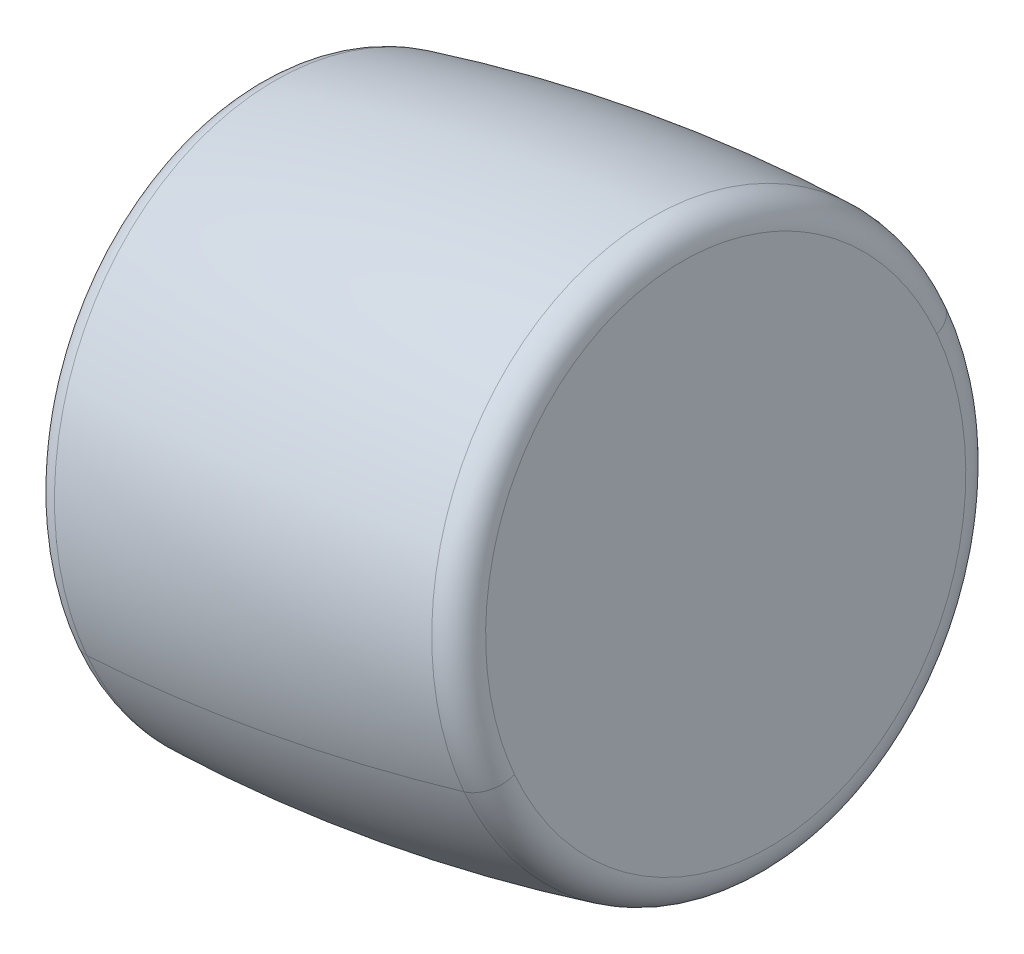
ISO-10303-21;
HEADER;
FILE_DESCRIPTION(('STEP AP214'),'2;1');
FILE_NAME('part.step','',(''),(''),'','','');
FILE_SCHEMA(('AUTOMOTIVE_DESIGN { 1 0 10303 214 1 1 1 1 }'));
ENDSEC;
DATA;
#1=APPLICATION_CONTEXT('core data for automotive mechanical design processes');
#2=APPLICATION_PROTOCOL_DEFINITION('international standard','automotive_design',2000,#1);
#3=PRODUCT_CONTEXT('',#1,'mechanical');
#4=PRODUCT('Part','Part','',(#3));
#5=PRODUCT_RELATED_PRODUCT_CATEGORY('part','',(#4));
#6=PRODUCT_DEFINITION_FORMATION('','',#4);
#7=PRODUCT_DEFINITION_CONTEXT('part definition',#1,'design');
#8=PRODUCT_DEFINITION('design','',#6,#7);
#9=PRODUCT_DEFINITION_SHAPE('','',#8);
#10=(LENGTH_UNIT() NAMED_UNIT(*) SI_UNIT(.MILLI.,.METRE.));
#11=(NAMED_UNIT(*) PLANE_ANGLE_UNIT() SI_UNIT($,.RADIAN.));
#12=(NAMED_UNIT(*) SI_UNIT($,.STERADIAN.) SOLID_ANGLE_UNIT());
#13=UNCERTAINTY_MEASURE_WITH_UNIT(LENGTH_MEASURE(1.E-05),#10,'distance_accuracy_value','');
#14=(GEOMETRIC_REPRESENTATION_CONTEXT(3) GLOBAL_UNCERTAINTY_ASSIGNED_CONTEXT((#13)) GLOBAL_UNIT_ASSIGNED_CONTEXT((#10,
#11,#12)) REPRESENTATION_CONTEXT('',''));
#15=CARTESIAN_POINT('',(0.,0.,0.));
#16=DIRECTION('',(0.,0.,1.));
#17=DIRECTION('',(1.,0.,0.));
#18=AXIS2_PLACEMENT_3D('',#15,#16,#17);
#19=CARTESIAN_POINT('',(1.62144652048644,29.898107644064,0.));
#20=DIRECTION('',(0.982988923693704,0.183664846651431,0.));
#21=DIRECTION('',(-0.183664846651431,0.982988923693704,0.));
#22=AXIS2_PLACEMENT_3D('',#19,#20,#21);
#23=PLANE('',#22);
#24=CARTESIAN_POINT('',(1.88033307099988,28.5125261553482,4.33817842139196));
#25=CARTESIAN_POINT('',(1.8933703069696,28.4427498275017,4.31511603856905));
#26=CARTESIAN_POINT('',(1.90630337528916,28.3735310132361,4.29030854774773));
#27=CARTESIAN_POINT('',(1.93193047390283,28.2363727353025,4.23726961898321));
#28=CARTESIAN_POINT('',(1.94462450419694,28.1684332716346,4.20903818104001));
#29=CARTESIAN_POINT('',(1.96974282403459,28.0339980183329,4.14921762690666));
#30=CARTESIAN_POINT('',(1.98216711357812,27.9675022286991,4.1176285107165));
#31=CARTESIAN_POINT('',(2.00671605332074,27.8361143431272,4.0511691681078));
#32=CARTESIAN_POINT('',(2.01884070351983,27.7712222471891,4.01629894168925));
#33=CARTESIAN_POINT('',(2.04276114649199,27.643198126514,3.94336125890223));
#34=CARTESIAN_POINT('',(2.05455693926505,27.580066101777,3.90529380253376));
#35=CARTESIAN_POINT('',(2.07779125262832,27.4557142015515,3.82605340121778));
#36=CARTESIAN_POINT('',(2.08922977321853,27.3944943260631,3.78488045627027));
#37=CARTESIAN_POINT('',(2.11172198519077,27.2741142117342,3.69952825804146));
#38=CARTESIAN_POINT('',(2.12277567657281,27.2149539728939,3.65534900476016));
#39=CARTESIAN_POINT('',(2.14447160098607,27.098835653159,3.56409062396221));
#40=CARTESIAN_POINT('',(2.1551138340173,27.0418775722644,3.51701149644556));
#41=CARTESIAN_POINT('',(2.17596120361239,26.9303007856678,3.42006678427362));
#42=CARTESIAN_POINT('',(2.18616634017625,26.8756820799658,3.37020119961833));
#43=CARTESIAN_POINT('',(2.20611493178082,26.7689156249359,3.26780370390311));
#44=CARTESIAN_POINT('',(2.21585838682154,26.716767875608,3.21527179284319));
#45=CARTESIAN_POINT('',(2.23486014253996,26.6150689618393,3.10766819824737));
#46=CARTESIAN_POINT('',(2.24411844321767,26.5655177973985,3.05259651471149));
#47=CARTESIAN_POINT('',(2.2621275861537,26.4691314264947,2.94004604768552));
#48=CARTESIAN_POINT('',(2.27087842841201,26.4222962200317,2.88256726419544));
#49=CARTESIAN_POINT('',(2.28785157296353,26.3314545951994,2.76534106868171));
#50=CARTESIAN_POINT('',(2.29607387525673,26.2874481768301,2.70559365665808));
#51=CARTESIAN_POINT('',(2.31197013163166,26.2023701435012,2.58397414082697));
#52=CARTESIAN_POINT('',(2.3196440857134,26.1612985285416,2.52210203701949));
#53=CARTESIAN_POINT('',(2.33442515843785,26.0821890471501,2.39638219293789));
#54=CARTESIAN_POINT('',(2.34153227708056,26.0441511807182,2.33253445266376));
#55=CARTESIAN_POINT('',(2.35516255725565,25.971200832934,2.20301715044764));
#56=CARTESIAN_POINT('',(2.36168571878803,25.9362883515817,2.13734758850565));
#57=CARTESIAN_POINT('',(2.37413236987495,25.8696728811823,2.00434484668048));
#58=CARTESIAN_POINT('',(2.38005585942949,25.8379698921352,1.9370116667973));
#59=CARTESIAN_POINT('',(2.39128889635557,25.7778497816236,1.80084390061779));
#60=CARTESIAN_POINT('',(2.3965984437271,25.7494326601592,1.73200931432145));
#61=CARTESIAN_POINT('',(2.40659080512249,25.6959527441475,1.59300456386321));
#62=CARTESIAN_POINT('',(2.41127361914634,25.6708899496003,1.5228343997013));
#63=CARTESIAN_POINT('',(2.42000123253721,25.6241790658906,1.38132753958357));
#64=CARTESIAN_POINT('',(2.42404603190422,25.602530976728,1.30999084362774));
#65=CARTESIAN_POINT('',(2.43148787170546,25.5627016559304,1.16632277627106));
#66=CARTESIAN_POINT('',(2.43488491213969,25.5445204242954,1.09399140487022));
#67=CARTESIAN_POINT('',(2.44102305030739,25.5116686187324,0.948508239232712));
#68=CARTESIAN_POINT('',(2.44376414804087,25.4969980448044,0.875356444996044));
#69=CARTESIAN_POINT('',(2.44858379726255,25.4712028973531,0.72840866276654));
#70=CARTESIAN_POINT('',(2.45066234875075,25.4600783238297,0.654612674773703));
#71=CARTESIAN_POINT('',(2.45415189806929,25.4414019772596,0.5065542860307));
#72=CARTESIAN_POINT('',(2.45556289589962,25.4338502042129,0.432291885280534));
#73=CARTESIAN_POINT('',(2.45771393868505,25.4223376514788,0.283479575650897));
#74=CARTESIAN_POINT('',(2.45845398364015,25.4183768717915,0.208929666771425));
#75=CARTESIAN_POINT('',(2.459261337842,25.4140558476413,0.0597219381434714));
#76=CARTESIAN_POINT('',(2.45932864708875,25.4136956031785,-0.0149358816050114));
#77=CARTESIAN_POINT('',(2.45879036772003,25.4165765173379,-0.164179574743964));
#78=CARTESIAN_POINT('',(2.45818477910456,25.4198176759601,-0.238765448134434));
#79=CARTESIAN_POINT('',(2.45630216292742,25.4298935880546,-0.387685564655411));
#80=CARTESIAN_POINT('',(2.45502513536574,25.4367283415268,-0.462019807785917));
#81=CARTESIAN_POINT('',(2.45180271776744,25.4539749778015,-0.610257586084357));
#82=CARTESIAN_POINT('',(2.44985732773081,25.464386860604,-0.68416112125229));
#83=CARTESIAN_POINT('',(2.4453028717976,25.4887626724015,-0.831359443536175));
#84=CARTESIAN_POINT('',(2.44269380590102,25.5027266013966,-0.904654230652128));
#85=CARTESIAN_POINT('',(2.43681828371616,25.5341728652512,-1.05045848327003));
#86=CARTESIAN_POINT('',(2.43355182742789,25.5516552001109,-1.12296794877197));
#87=CARTESIAN_POINT('',(2.42636939363897,25.5900961592187,-1.26702687650838));
#88=CARTESIAN_POINT('',(2.42245341613832,25.6110547834669,-1.33857633874285));
#89=CARTESIAN_POINT('',(2.41398137385744,25.6563978301904,-1.48054289102279));
#90=CARTESIAN_POINT('',(2.4094253090772,25.6807822526656,-1.55095998106826));
#91=CARTESIAN_POINT('',(2.39968406819628,25.7329181516336,-1.69049214803247));
#92=CARTESIAN_POINT('',(2.39449889209558,25.7606696281263,-1.75960722495122));
#93=CARTESIAN_POINT('',(2.38351192011713,25.8194727793915,-1.89636886138792));
#94=CARTESIAN_POINT('',(2.37771012423936,25.8505244541641,-1.96401542090588));
#95=CARTESIAN_POINT('',(2.36550388974122,25.9158531957847,-2.097677056054));
#96=CARTESIAN_POINT('',(2.35909945112084,25.9501302626328,-2.16369213168415));
#97=CARTESIAN_POINT('',(2.34570335999105,26.0218272119481,-2.29393176295723));
#98=CARTESIAN_POINT('',(2.33871170748164,26.0592470944153,-2.35815631860015));
#99=CARTESIAN_POINT('',(2.32415803207711,26.1371395271945,-2.4846601873188));
#100=CARTESIAN_POINT('',(2.31659600918197,26.1776120775065,-2.54693950039454));
#101=CARTESIAN_POINT('',(2.30091981058148,26.2615123440564,-2.6694028476586));
#102=CARTESIAN_POINT('',(2.29280563487612,26.3049400602944,-2.72958688184692));
#103=CARTESIAN_POINT('',(2.27604467841518,26.3946460375241,-2.8477146827263));
#104=CARTESIAN_POINT('',(2.2673978976596,26.4409242985159,-2.90565844941736));
#105=CARTESIAN_POINT('',(2.24959256195041,26.536219876869,-3.01916612369298));
#106=CARTESIAN_POINT('',(2.24043400699681,26.5852371942303,-3.07473003127753));
#107=CARTESIAN_POINT('',(2.22162718665266,26.6858927983116,-3.18334412901995));
#108=CARTESIAN_POINT('',(2.21197892126211,26.7375310850315,-3.23639431917782));
#109=CARTESIAN_POINT('',(2.19221592356049,26.8433042266744,-3.33985317951211));
#110=CARTESIAN_POINT('',(2.18210119124942,26.8974390815973,-3.39026184968854));
#111=CARTESIAN_POINT('',(2.16142962698282,27.0080749440389,-3.48831623115823));
#112=CARTESIAN_POINT('',(2.1508727950273,27.0645759515576,-3.53596194245149));
#113=CARTESIAN_POINT('',(2.12934246380467,27.1798080033147,-3.62837562346308));
#114=CARTESIAN_POINT('',(2.11836896453756,27.2385390475532,-3.67314359318139));
#115=CARTESIAN_POINT('',(2.09603173481263,27.35808968452,-3.75969394108283));
#116=CARTESIAN_POINT('',(2.08466800435483,27.4189092772485,-3.80147631926594));
#117=CARTESIAN_POINT('',(2.06157768847053,27.5424904914692,-3.88195482668821));
#118=CARTESIAN_POINT('',(2.04985110304405,27.6052521129615,-3.92065095592737));
#119=CARTESIAN_POINT('',(2.02606332759382,27.7325661864667,-3.99486374309703));
#120=CARTESIAN_POINT('',(2.01400213757007,27.7971186384795,-4.03038040102752));
#121=CARTESIAN_POINT('',(1.98957420938853,27.9278588605145,-4.09814868283998));
#122=CARTESIAN_POINT('',(1.97720747123074,27.9940466305367,-4.13040030672195));
#123=CARTESIAN_POINT('',(1.95219823933651,28.1278980364553,-4.19156082345055));
#124=CARTESIAN_POINT('',(1.93955574560008,28.1955616723517,-4.22046971629717));
#125=CARTESIAN_POINT('',(1.91402545942334,28.3322018023929,-4.27487512690003));
#126=CARTESIAN_POINT('',(1.90113766698304,28.4011782965378,-4.30037164465626));
#127=CARTESIAN_POINT('',(1.87514783121939,28.5402779726603,-4.34789088173406));
#128=CARTESIAN_POINT('',(1.86204578789603,28.6104011546378,-4.36991360105563));
#129=CARTESIAN_POINT('',(1.83565901433628,28.7516252735378,-4.41043218660339));
#130=CARTESIAN_POINT('',(1.82237428409989,28.8227262104602,-4.42892805282958));
#131=CARTESIAN_POINT('',(1.79565414079263,28.9657345508662,-4.46234837402822));
#132=CARTESIAN_POINT('',(1.78221872772177,29.0376419543497,-4.47727282900067));
#133=CARTESIAN_POINT('',(1.75522958583311,29.1820899966411,-4.50351437335977));
#134=CARTESIAN_POINT('',(1.74167585701532,29.254630635449,-4.51483146274642));
#135=CARTESIAN_POINT('',(1.71448273575029,29.4001703916491,-4.53383101212213));
#136=CARTESIAN_POINT('',(1.70084334330306,29.4731695090414,-4.5415134721112));
#137=CARTESIAN_POINT('',(1.67351175327914,29.6194503610949,-4.55322525479427));
#138=CARTESIAN_POINT('',(1.65981955570245,29.6927320957562,-4.55725457748827));
#139=CARTESIAN_POINT('',(1.63241534108966,29.8394016404079,-4.56165037925597));
#140=CARTESIAN_POINT('',(1.61870332405356,29.9127894503984,-4.56201685832966));
#141=CARTESIAN_POINT('',(1.59129250409596,30.0594943473829,-4.55908608749081));
#142=CARTESIAN_POINT('',(1.57759370117445,30.1328114343771,-4.55578883757825));
#143=CARTESIAN_POINT('',(1.55024231059962,30.27919826056,-4.54553856140771));
#144=CARTESIAN_POINT('',(1.5365897229463,30.3522679997488,-4.53858553514971));
#145=CARTESIAN_POINT('',(1.50936365491348,30.4979840896807,-4.52104042211545));
#146=CARTESIAN_POINT('',(1.49579017453399,30.5706304404238,-4.51044833533918));
#147=CARTESIAN_POINT('',(1.4687550143098,30.7153247765212,-4.48565074774462));
#148=CARTESIAN_POINT('',(1.45529333446511,30.7873727618755,-4.47144524692632));
#149=CARTESIAN_POINT('',(1.42851422971887,30.9306966686106,-4.43945457131975));
#150=CARTESIAN_POINT('',(1.41519680481734,31.0019725899913,-4.42166939653148));
#151=CARTESIAN_POINT('',(1.38873820307259,31.1435811390725,-4.38256401871208));
#152=CARTESIAN_POINT('',(1.37559702622936,31.2139137667729,-4.36124381568095));
#153=CARTESIAN_POINT('',(1.36255996997287,31.2836891327797,-4.33817842139197));
#154=B_SPLINE_CURVE_WITH_KNOTS('',3,(#24,#25,#26,#27,#28,#29,#30,#31,#32,#33,#34,#35,#36,#37,
#38,#39,#40,#41,#42,#43,#44,#45,#46,#47,#48,#49,#50,#51,#52,#53,#54,#55,#56,#57,#58,#59,#60,#61,
#62,#63,#64,#65,#66,#67,#68,#69,#70,#71,#72,#73,#74,#75,#76,#77,#78,#79,#80,#81,#82,#83,#84,#85,
#86,#87,#88,#89,#90,#91,#92,#93,#94,#95,#96,#97,#98,#99,#100,#101,#102,#103,#104,#105,#106,#107,
#108,#109,#110,#111,#112,#113,#114,#115,#116,#117,#118,#119,#120,#121,#122,#123,#124,#125,#126,
#127,#128,#129,#130,#131,#132,#133,#134,#135,#136,#137,#138,#139,#140,#141,#142,#143,#144,#145,
#146,#147,#148,#149,#150,#151,#152,#153),.UNSPECIFIED.,.F.,.F.,(4,2,2,2,2,2,2,2,2,2,2,2,2,2,2,2,
2,2,2,2,2,2,2,2,2,2,2,2,2,2,2,2,2,2,2,2,2,2,2,2,2,2,2,2,2,2,2,2,2,2,2,2,2,2,2,2,2,2,2,2,2,2,2,2,
4),(0.,0.223886227975766,0.44777245595153,0.671658683927296,0.895544911903059,1.11943113987883,
1.34331736785459,1.56720359583036,1.79108982380612,2.01497605178189,2.23886227975765,
2.46274850773342,2.68663473570918,2.91052096368495,3.13440719166071,3.35829341963648,
3.58217964761224,3.80606587558801,4.02995210356377,4.25383833153954,4.4777245595153,
4.70161078749107,4.92549701546684,5.1493832434426,5.37326947141837,5.59715569939413,
5.82104192736989,6.04492815534566,6.26881438332143,6.49270061129719,6.71658683927296,
6.94047306724872,7.16435929522449,7.38824552320025,7.61213175117602,7.83601797915178,
8.05990420712755,8.28379043510331,8.50767666307908,8.73156289105485,8.95544911903061,
9.17933534700638,9.40322157498214,9.62710780295791,9.85099403093367,10.0748802589094,
10.2987664868852,10.522652714861,10.7465389428367,10.9704251708125,11.1943113987883,
11.418197626764,11.6420838547398,11.8659700827156,12.0898563106913,12.3137425386671,
12.5376287666429,12.7615149946186,12.9854012225944,13.2092874505701,13.4331736785459,
13.6570599065217,13.8809461344974,14.1048323624732,14.328718590449),.UNSPECIFIED.);
#155=CARTESIAN_POINT('',(1.88033307099988,28.5125261553482,4.33817842139196));
#156=VERTEX_POINT('',#155);
#157=CARTESIAN_POINT('',(1.36255996997287,31.2836891327797,-4.33817842139196));
#158=VERTEX_POINT('',#157);
#159=EDGE_CURVE('E11',#156,#158,#154,.T.);
#160=ORIENTED_EDGE('',*,*,#159,.F.);
#161=CARTESIAN_POINT('',(1.36255996997287,31.2836891327797,-4.33817842139196));
#162=CARTESIAN_POINT('',(1.34952273400315,31.3534654606262,-4.31511603856905));
#163=CARTESIAN_POINT('',(1.33658966568359,31.4226842748919,-4.29030854774773));
#164=CARTESIAN_POINT('',(1.31096256706992,31.5598425528255,-4.23726961898321));
#165=CARTESIAN_POINT('',(1.29826853677581,31.6277820164934,-4.20903818104001));
#166=CARTESIAN_POINT('',(1.27315021693816,31.762217269795,-4.14921762690666));
#167=CARTESIAN_POINT('',(1.26072592739463,31.8287130594288,-4.1176285107165));
#168=CARTESIAN_POINT('',(1.23617698765201,31.9601009450007,-4.0511691681078));
#169=CARTESIAN_POINT('',(1.22405233745292,32.0249930409389,-4.01629894168925));
#170=CARTESIAN_POINT('',(1.20013189448076,32.153017161614,-3.94336125890223));
#171=CARTESIAN_POINT('',(1.1883361017077,32.2161491863509,-3.90529380253376));
#172=CARTESIAN_POINT('',(1.16510178834443,32.3405010865764,-3.82605340121778));
#173=CARTESIAN_POINT('',(1.15366326775422,32.4017209620649,-3.78488045627027));
#174=CARTESIAN_POINT('',(1.13117105578198,32.5221010763937,-3.69952825804146));
#175=CARTESIAN_POINT('',(1.12011736439994,32.581261315234,-3.65534900476016));
#176=CARTESIAN_POINT('',(1.09842143998668,32.697379634969,-3.56409062396221));
#177=CARTESIAN_POINT('',(1.08777920695545,32.7543377158636,-3.51701149644556));
#178=CARTESIAN_POINT('',(1.06693183736036,32.8659145024601,-3.42006678427362));
#179=CARTESIAN_POINT('',(1.0567267007965,32.9205332081621,-3.37020119961833));
#180=CARTESIAN_POINT('',(1.03677810919193,33.027299663192,-3.26780370390311));
#181=CARTESIAN_POINT('',(1.02703465415122,33.0794474125199,-3.21527179284319));
#182=CARTESIAN_POINT('',(1.00803289843279,33.1811463262886,-3.10766819824737));
#183=CARTESIAN_POINT('',(0.99877459775508,33.2306974907294,-3.05259651471149));
#184=CARTESIAN_POINT('',(0.980765454819054,33.3270838616332,-2.94004604768552));
#185=CARTESIAN_POINT('',(0.97201461256074,33.3739190680962,-2.88256726419544));
#186=CARTESIAN_POINT('',(0.955041468009225,33.4647606929285,-2.76534106868172));
#187=CARTESIAN_POINT('',(0.946819165716024,33.5087671112978,-2.70559365665808));
#188=CARTESIAN_POINT('',(0.930922909341087,33.5938451446267,-2.58397414082697));
#189=CARTESIAN_POINT('',(0.923248955259351,33.6349167595863,-2.52210203701949));
#190=CARTESIAN_POINT('',(0.908467882534901,33.7140262409778,-2.39638219293789));
#191=CARTESIAN_POINT('',(0.901360763892187,33.7520641074097,-2.33253445266376));
#192=CARTESIAN_POINT('',(0.887730483717099,33.8250144551939,-2.20301715044765));
#193=CARTESIAN_POINT('',(0.881207322184724,33.8599269365462,-2.13734758850566));
#194=CARTESIAN_POINT('',(0.868760671097807,33.9265424069456,-2.00434484668049));
#195=CARTESIAN_POINT('',(0.862837181543264,33.9582453959927,-1.9370116667973));
#196=CARTESIAN_POINT('',(0.851604144617186,34.0183655065043,-1.80084390061779));
#197=CARTESIAN_POINT('',(0.84629459724565,34.0467826279688,-1.73200931432146));
#198=CARTESIAN_POINT('',(0.836302235850263,34.1002625439804,-1.59300456386321));
#199=CARTESIAN_POINT('',(0.831619421826411,34.1253253385276,-1.52283439970131));
#200=CARTESIAN_POINT('',(0.822891808435545,34.1720362222373,-1.38132753958357));
#201=CARTESIAN_POINT('',(0.818847009068529,34.1936843113999,-1.30999084362774));
#202=CARTESIAN_POINT('',(0.811405169267289,34.2335136321975,-1.16632277627107));
#203=CARTESIAN_POINT('',(0.808008128833066,34.2516948638325,-1.09399140487023));
#204=CARTESIAN_POINT('',(0.801869990665363,34.2845466693956,-0.948508239232716));
#205=CARTESIAN_POINT('',(0.799128892931884,34.2992172433235,-0.875356444996049));
#206=CARTESIAN_POINT('',(0.794309243710202,34.3250123907749,-0.728408662766544));
#207=CARTESIAN_POINT('',(0.792230692221999,34.3361369642982,-0.654612674773708));
#208=CARTESIAN_POINT('',(0.788741142903463,34.3548133108683,-0.506554286030705));
#209=CARTESIAN_POINT('',(0.78733014507313,34.3623650839151,-0.432291885280538));
#210=CARTESIAN_POINT('',(0.785179102287698,34.3738776366491,-0.283479575650901));
#211=CARTESIAN_POINT('',(0.784439057332598,34.3778384163365,-0.20892966677143));
#212=CARTESIAN_POINT('',(0.783631703130749,34.3821594404867,-0.059721938143475));
#213=CARTESIAN_POINT('',(0.783564393883999,34.3825196849495,0.0149358816050083));
#214=CARTESIAN_POINT('',(0.78410267325272,34.37963877079,0.164179574743961));
#215=CARTESIAN_POINT('',(0.784708261868191,34.3763976121678,0.23876544813443));
#216=CARTESIAN_POINT('',(0.786590878045336,34.3663217000734,0.387685564655407));
#217=CARTESIAN_POINT('',(0.787867905607011,34.3594869466011,0.462019807785913));
#218=CARTESIAN_POINT('',(0.791090323205311,34.3422403103264,0.610257586084351));
#219=CARTESIAN_POINT('',(0.793035713241938,34.331828427524,0.684161121252282));
#220=CARTESIAN_POINT('',(0.797590169175149,34.3074526157264,0.831359443536168));
#221=CARTESIAN_POINT('',(0.800199235071733,34.2934886867314,0.904654230652122));
#222=CARTESIAN_POINT('',(0.806074757256589,34.2620424228767,1.05045848327002));
#223=CARTESIAN_POINT('',(0.80934121354486,34.2445600880171,1.12296794877197));
#224=CARTESIAN_POINT('',(0.816523647333781,34.2061191289093,1.26702687650838));
#225=CARTESIAN_POINT('',(0.820439624834431,34.185160504661,1.33857633874285));
#226=CARTESIAN_POINT('',(0.828911667115314,34.1398174579376,1.48054289102278));
#227=CARTESIAN_POINT('',(0.833467731895547,34.1154330354623,1.55095998106825));
#228=CARTESIAN_POINT('',(0.843208972776474,34.0632971364944,1.69049214803247));
#229=CARTESIAN_POINT('',(0.848394148877168,34.0355456600017,1.75960722495121));
#230=CARTESIAN_POINT('',(0.859381120855625,33.9767425087364,1.89636886138792));
#231=CARTESIAN_POINT('',(0.865182916733387,33.9456908339639,1.96401542090588));
#232=CARTESIAN_POINT('',(0.877389151231531,33.8803620923432,2.09767705605399));
#233=CARTESIAN_POINT('',(0.883793589851914,33.8460850254951,2.16369213168415));
#234=CARTESIAN_POINT('',(0.897189680981702,33.7743880761798,2.29393176295722));
#235=CARTESIAN_POINT('',(0.904181333491107,33.7369681937126,2.35815631860014));
#236=CARTESIAN_POINT('',(0.918735008895646,33.6590757609334,2.4846601873188));
#237=CARTESIAN_POINT('',(0.92629703179078,33.6186032106215,2.54693950039453));
#238=CARTESIAN_POINT('',(0.94197323039127,33.5347029440715,2.66940284765859));
#239=CARTESIAN_POINT('',(0.950087406096626,33.4912752278336,2.72958688184692));
#240=CARTESIAN_POINT('',(0.966848362557566,33.4015692506038,2.8477146827263));
#241=CARTESIAN_POINT('',(0.97549514331315,33.3552909896121,2.90565844941736));
#242=CARTESIAN_POINT('',(0.993300479022339,33.259995411259,3.01916612369297));
#243=CARTESIAN_POINT('',(1.00245903397594,33.2109780938977,3.07473003127753));
#244=CARTESIAN_POINT('',(1.02126585432009,33.1103224898164,3.18334412901995));
#245=CARTESIAN_POINT('',(1.03091411971064,33.0586842030964,3.23639431917781));
#246=CARTESIAN_POINT('',(1.05067711741226,32.9529110614535,3.3398531795121));
#247=CARTESIAN_POINT('',(1.06079184972333,32.8987762065306,3.39026184968853));
#248=CARTESIAN_POINT('',(1.08146341398993,32.788140344089,3.48831623115823));
#249=CARTESIAN_POINT('',(1.09202024594545,32.7316393365704,3.53596194245149));
#250=CARTESIAN_POINT('',(1.11355057716808,32.6164072848132,3.62837562346307));
#251=CARTESIAN_POINT('',(1.12452407643519,32.5576762405748,3.67314359318139));
#252=CARTESIAN_POINT('',(1.14686130616012,32.4381256036079,3.75969394108282));
#253=CARTESIAN_POINT('',(1.15822503661792,32.3773060108795,3.80147631926594));
#254=CARTESIAN_POINT('',(1.18131535250222,32.2537247966587,3.88195482668821));
#255=CARTESIAN_POINT('',(1.1930419379287,32.1909631751664,3.92065095592737));
#256=CARTESIAN_POINT('',(1.21682971337893,32.0636491016613,3.99486374309702));
#257=CARTESIAN_POINT('',(1.22889090340268,31.9990966496485,4.03038040102751));
#258=CARTESIAN_POINT('',(1.25331883158422,31.8683564276135,4.09814868283997));
#259=CARTESIAN_POINT('',(1.26568556974201,31.8021686575912,4.13040030672194));
#260=CARTESIAN_POINT('',(1.29069480163624,31.6683172516726,4.19156082345054));
#261=CARTESIAN_POINT('',(1.30333729537267,31.6006536157763,4.22046971629717));
#262=CARTESIAN_POINT('',(1.32886758154941,31.464013485735,4.27487512690002));
#263=CARTESIAN_POINT('',(1.34175537398971,31.3950369915901,4.30037164465625));
#264=CARTESIAN_POINT('',(1.36774520975336,31.2559373154677,4.34789088173406));
#265=CARTESIAN_POINT('',(1.38084725307672,31.1858141334902,4.36991360105563));
#266=CARTESIAN_POINT('',(1.40723402663647,31.0445900145902,4.41043218660339));
#267=CARTESIAN_POINT('',(1.42051875687286,30.9734890776677,4.42892805282958));
#268=CARTESIAN_POINT('',(1.44723890018012,30.8304807372618,4.46234837402822));
#269=CARTESIAN_POINT('',(1.46067431325098,30.7585733337782,4.47727282900067));
#270=CARTESIAN_POINT('',(1.48766345513964,30.6141252914868,4.50351437335977));
#271=CARTESIAN_POINT('',(1.50121718395743,30.541584652679,4.51483146274641));
#272=CARTESIAN_POINT('',(1.52841030522246,30.3960448964788,4.53383101212213));
#273=CARTESIAN_POINT('',(1.54204969766969,30.3230457790866,4.54151347211119));
#274=CARTESIAN_POINT('',(1.56938128769361,30.1767649270331,4.55322525479427));
#275=CARTESIAN_POINT('',(1.5830734852703,30.1034831923718,4.55725457748827));
#276=CARTESIAN_POINT('',(1.61047769988309,29.9568136477201,4.56165037925596));
#277=CARTESIAN_POINT('',(1.62418971691919,29.8834258377296,4.56201685832966));
#278=CARTESIAN_POINT('',(1.65160053687679,29.736720940745,4.5590860874908));
#279=CARTESIAN_POINT('',(1.6652993397983,29.6634038537509,4.55578883757825));
#280=CARTESIAN_POINT('',(1.69265073037313,29.517017027568,4.54553856140771));
#281=CARTESIAN_POINT('',(1.70630331802645,29.4439472883791,4.53858553514971));
#282=CARTESIAN_POINT('',(1.73352938605927,29.2982311984472,4.52104042211545));
#283=CARTESIAN_POINT('',(1.74710286643876,29.2255848477041,4.51044833533918));
#284=CARTESIAN_POINT('',(1.77413802666295,29.0808905116067,4.48565074774462));
#285=CARTESIAN_POINT('',(1.78759970650764,29.0088425262524,4.47144524692632));
#286=CARTESIAN_POINT('',(1.81437881125388,28.8655186195173,4.43945457131975));
#287=CARTESIAN_POINT('',(1.82769623615541,28.7942426981366,4.42166939653148));
#288=CARTESIAN_POINT('',(1.85415483790017,28.6526341490555,4.38256401871208));
#289=CARTESIAN_POINT('',(1.86729601474339,28.5823015213551,4.36124381568095));
#290=CARTESIAN_POINT('',(1.88033307099988,28.5125261553482,4.33817842139197));
#291=B_SPLINE_CURVE_WITH_KNOTS('',3,(#161,#162,#163,#164,#165,#166,#167,#168,#169,#170,#171,
#172,#173,#174,#175,#176,#177,#178,#179,#180,#181,#182,#183,#184,#185,#186,#187,#188,#189,#190,
#191,#192,#193,#194,#195,#196,#197,#198,#199,#200,#201,#202,#203,#204,#205,#206,#207,#208,#209,
#210,#211,#212,#213,#214,#215,#216,#217,#218,#219,#220,#221,#222,#223,#224,#225,#226,#227,#228,
#229,#230,#231,#232,#233,#234,#235,#236,#237,#238,#239,#240,#241,#242,#243,#244,#245,#246,#247,
#248,#249,#250,#251,#252,#253,#254,#255,#256,#257,#258,#259,#260,#261,#262,#263,#264,#265,#266,
#267,#268,#269,#270,#271,#272,#273,#274,#275,#276,#277,#278,#279,#280,#281,#282,#283,#284,#285,
#286,#287,#288,#289,#290),.UNSPECIFIED.,.F.,.F.,(4,2,2,2,2,2,2,2,2,2,2,2,2,2,2,2,2,2,2,2,2,2,2,
2,2,2,2,2,2,2,2,2,2,2,2,2,2,2,2,2,2,2,2,2,2,2,2,2,2,2,2,2,2,2,2,2,2,2,2,2,2,2,2,2,4),(0.,
0.223886227975769,0.44777245595153,0.671658683927299,0.895544911903059,1.11943113987883,
1.34331736785459,1.56720359583036,1.79108982380612,2.01497605178189,2.23886227975765,
2.46274850773342,2.68663473570919,2.91052096368495,3.13440719166071,3.35829341963648,
3.58217964761224,3.80606587558801,4.02995210356378,4.25383833153954,4.4777245595153,
4.70161078749107,4.92549701546683,5.1493832434426,5.37326947141836,5.59715569939413,
5.8210419273699,6.04492815534566,6.26881438332143,6.49270061129719,6.71658683927296,
6.94047306724872,7.16435929522449,7.38824552320025,7.61213175117602,7.83601797915178,
8.05990420712755,8.28379043510331,8.50767666307908,8.73156289105485,8.95544911903061,
9.17933534700637,9.40322157498214,9.62710780295791,9.85099403093367,10.0748802589094,
10.2987664868852,10.522652714861,10.7465389428367,10.9704251708125,11.1943113987883,
11.418197626764,11.6420838547398,11.8659700827156,12.0898563106913,12.3137425386671,
12.5376287666429,12.7615149946186,12.9854012225944,13.2092874505701,13.4331736785459,
13.6570599065217,13.8809461344974,14.1048323624732,14.328718590449),.UNSPECIFIED.);
#292=EDGE_CURVE('E26',#158,#156,#291,.T.);
#293=ORIENTED_EDGE('',*,*,#292,.F.);
#294=EDGE_LOOP('',(#160,#293));
#295=FACE_BOUND('',#294,.T.);
#296=ADVANCED_FACE('F17',(#295),#23,.F.);
#297=CARTESIAN_POINT('',(2.16209042851867,29.9991233097224,0.));
#298=DIRECTION('',(0.982988923693704,0.183664846651431,0.));
#299=DIRECTION('',(0.174675649222194,-0.934878021324857,-0.309016994374947));
#300=AXIS2_PLACEMENT_3D('',#297,#298,#299);
#301=TOROIDAL_SURFACE('',#300,4.56143073209925,0.55000000000077);
#302=CARTESIAN_POINT('',(1.90320387800517,31.3847047984382,-4.33817842139197));
#303=DIRECTION('',(-0.174675649222193,0.934878021324856,0.30901699437495));
#304=DIRECTION('',(-0.157750977152396,0.283216329671778,-0.945993202837479));
#305=AXIS2_PLACEMENT_3D('',#302,#303,#304);
#306=CIRCLE('',#305,0.55000000000077);
#307=CARTESIAN_POINT('',(1.81644084057123,31.5404737797579,-4.85847468295331));
#308=VERTEX_POINT('',#307);
#309=EDGE_CURVE('E104',#308,#158,#306,.T.);
#310=ORIENTED_EDGE('',*,*,#309,.T.);
#311=ORIENTED_EDGE('',*,*,#292,.T.);
#312=CARTESIAN_POINT('',(2.42097697903217,28.6135418210066,4.33817842139197));
#313=DIRECTION('',(0.174675649222194,-0.934878021324856,-0.30901699437495));
#314=DIRECTION('',(-0.0448441792742032,-0.321069867428433,0.945993202837479));
#315=AXIS2_PLACEMENT_3D('',#312,#313,#314);
#316=CIRCLE('',#315,0.55000000000077);
#317=CARTESIAN_POINT('',(2.39631268043133,28.4369533939207,4.85847468295331));
#318=VERTEX_POINT('',#317);
#319=EDGE_CURVE('E100',#318,#156,#316,.T.);
#320=ORIENTED_EDGE('',*,*,#319,.F.);
#321=CARTESIAN_POINT('',(2.10637676050128,29.9887135868393,0.));
#322=DIRECTION('',(0.982988923693704,0.183664846651431,0.));
#323=DIRECTION('',(-0.056755558884561,0.303760282703693,-0.951056516295153));
#324=AXIS2_PLACEMENT_3D('',#321,#322,#323);
#325=CIRCLE('',#324,5.1085025965434);
#326=EDGE_CURVE('E95',#308,#318,#325,.T.);
#327=ORIENTED_EDGE('',*,*,#326,.F.);
#328=EDGE_LOOP('',(#310,#311,#320,#327));
#329=FACE_BOUND('',#328,.T.);
#330=ADVANCED_FACE('F111',(#329),#301,.T.);
#331=CARTESIAN_POINT('',(5.74999999999828,30.6695,0.));
#332=DIRECTION('',(0.982988923693704,0.183664846651431,0.));
#333=DIRECTION('',(0.174675649222194,-0.934878021324857,-0.309016994374947));
#334=AXIS2_PLACEMENT_3D('',#331,#332,#333);
#335=DEGENERATE_TOROIDAL_SURFACE('',#334,30.66949999996,35.9694999999604,.F.);
#336=CARTESIAN_POINT('',(7.49066461320621,21.3533240096304,29.1684278264759));
#337=DIRECTION('',(-0.174675649222192,0.934878021324848,0.309016994374976));
#338=DIRECTION('',(0.0448441792731058,0.321069867428291,-0.945993202837579));
#339=AXIS2_PLACEMENT_3D('',#336,#337,#338);
#340=CIRCLE('',#339,35.9694999999604);
#341=CARTESIAN_POINT('',(9.10368731956841,32.9020466060796,-4.85847468295291));
#342=VERTEX_POINT('',#341);
#343=EDGE_CURVE('E90',#342,#308,#340,.T.);
#344=ORIENTED_EDGE('',*,*,#343,.T.);
#345=ORIENTED_EDGE('',*,*,#326,.T.);
#346=CARTESIAN_POINT('',(4.00933538679051,39.9856759903688,-29.1684278264762));
#347=DIRECTION('',(0.174675649222194,-0.934878021324857,-0.309016994374947));
#348=DIRECTION('',(0.157750977151316,-0.283216329672013,0.945993202837588));
#349=AXIS2_PLACEMENT_3D('',#346,#347,#348);
#350=CIRCLE('',#349,35.9694999999604);
#351=CARTESIAN_POINT('',(9.68355915942851,29.7985262202425,4.85847468295296));
#352=VERTEX_POINT('',#351);
#353=EDGE_CURVE('E79',#352,#318,#350,.T.);
#354=ORIENTED_EDGE('',*,*,#353,.F.);
#355=CARTESIAN_POINT('',(9.39362323949852,31.3502864131606,0.));
#356=DIRECTION('',(0.982988923693704,0.183664846651431,0.));
#357=DIRECTION('',(-0.0567555588845763,0.303760282703776,-0.951056516295126));
#358=AXIS2_PLACEMENT_3D('',#355,#356,#357);
#359=CIRCLE('',#358,5.10850259654306);
#360=EDGE_CURVE('E77',#342,#352,#359,.T.);
#361=ORIENTED_EDGE('',*,*,#360,.F.);
#362=EDGE_LOOP('',(#344,#345,#354,#361));
#363=FACE_BOUND('',#362,.T.);
#364=ADVANCED_FACE('F120',(#363),#335,.F.);
#365=CARTESIAN_POINT('',(9.33790957148177,31.3398766902777,0.));
#366=DIRECTION('',(0.982988923693704,0.183664846651431,0.));
#367=DIRECTION('',(0.174675649221011,-0.934878021318527,-0.309016994394763));
#368=AXIS2_PLACEMENT_3D('',#365,#366,#367);
#369=TOROIDAL_SURFACE('',#368,4.56143073209951,0.550000000000103);
#370=CARTESIAN_POINT('',(9.07902302095172,32.7254581790821,-4.33817842136296));
#371=DIRECTION('',(-0.174675649221021,0.934878021318552,0.309016994394685));
#372=DIRECTION('',(0.982988923693703,0.183664846651437,0.));
#373=AXIS2_PLACEMENT_3D('',#370,#371,#372);
#374=CIRCLE('',#373,0.550000000000104);
#375=CARTESIAN_POINT('',(9.61966692898335,32.8264738447404,-4.33817842136296));
#376=VERTEX_POINT('',#375);
#377=EDGE_CURVE('E61',#376,#342,#374,.T.);
#378=ORIENTED_EDGE('',*,*,#377,.T.);
#379=ORIENTED_EDGE('',*,*,#360,.T.);
#380=CARTESIAN_POINT('',(9.59679612199529,29.9542952015618,4.33817842139221));
#381=DIRECTION('',(0.174675649222194,-0.934878021324857,-0.309016994374947));
#382=DIRECTION('',(0.982988923693704,0.18366484665143,0.));
#383=AXIS2_PLACEMENT_3D('',#380,#381,#382);
#384=CIRCLE('',#383,0.550000000000103);
#385=CARTESIAN_POINT('',(10.1374400300269,30.0553108672201,4.33817842139221));
#386=VERTEX_POINT('',#385);
#387=EDGE_CURVE('E63',#386,#352,#384,.T.);
#388=ORIENTED_EDGE('',*,*,#387,.F.);
#389=CARTESIAN_POINT('',(9.61966692898339,32.8264738447404,-4.33817842136309));
#390=CARTESIAN_POINT('',(9.3694652864017,34.1655730127731,-3.89493714105939));
#391=CARTESIAN_POINT('',(9.15051696049414,35.3374019345964,-2.91912196029315));
#392=CARTESIAN_POINT('',(9.01714067838151,36.0512424456714,-1.49024769285666));
#393=CARTESIAN_POINT('',(8.98372672006783,36.2300766184484,1.58302932853671));
#394=CARTESIAN_POINT('',(9.3425363015011,34.3096990900612,3.9624274954951));
#395=CARTESIAN_POINT('',(9.6046947995346,32.9066058769752,4.69156502526898));
#396=CARTESIAN_POINT('',(9.88717232034232,31.3947636316628,4.78031261104244));
#397=CARTESIAN_POINT('',(10.137440030027,30.0553108672201,4.33817842139235));
#398=B_SPLINE_CURVE_WITH_KNOTS('',5,(#389,#390,#391,#392,#393,#394,#395,#396,#397),
.UNSPECIFIED.,.F.,.F.,(6,3,6),(0.,1.57079632678452,3.14159265356904),.UNSPECIFIED.);
#399=EDGE_CURVE('E55',#376,#386,#398,.T.);
#400=ORIENTED_EDGE('',*,*,#399,.F.);
#401=EDGE_LOOP('',(#378,#379,#388,#400));
#402=FACE_BOUND('',#401,.T.);
#403=ADVANCED_FACE('F58',(#402),#369,.T.);
#404=CARTESIAN_POINT('',(9.04077900359125,35.924728241786,0.));
#405=DIRECTION('',(-0.982988923693704,-0.183664846651431,0.));
#406=DIRECTION('',(0.183664846651431,-0.982988923693704,0.));
#407=AXIS2_PLACEMENT_3D('',#404,#405,#406);
#408=PLANE('',#407);
#409=ORIENTED_EDGE('',*,*,#399,.T.);
#410=CARTESIAN_POINT('',(9.87855347951341,31.440892355936,0.));
#411=DIRECTION('',(0.982988923693704,0.183664846651431,0.));
#412=DIRECTION('',(-0.183664846651431,0.982988923693704,0.));
#413=AXIS2_PLACEMENT_3D('',#410,#411,#412);
#414=CIRCLE('',#413,4.56143073209965);
#415=EDGE_CURVE('E67',#386,#376,#414,.T.);
#416=ORIENTED_EDGE('',*,*,#415,.T.);
#417=EDGE_LOOP('',(#409,#416));
#418=FACE_BOUND('',#417,.T.);
#419=ADVANCED_FACE('F70',(#418),#408,.F.);
#420=CARTESIAN_POINT('',(9.33790957148177,31.3398766902777,0.));
#421=DIRECTION('',(0.982988923693704,0.183664846651431,0.));
#422=DIRECTION('',(-0.174675649221605,0.934878021321704,0.309016994384816));
#423=AXIS2_PLACEMENT_3D('',#420,#421,#422);
#424=TOROIDAL_SURFACE('',#423,4.56143073209951,0.550000000000103);
#425=ORIENTED_EDGE('',*,*,#377,.F.);
#426=ORIENTED_EDGE('',*,*,#415,.F.);
#427=ORIENTED_EDGE('',*,*,#387,.T.);
#428=CARTESIAN_POINT('',(9.39362323949852,31.3502864131606,0.));
#429=DIRECTION('',(0.982988923693704,0.183664846651431,0.));
#430=DIRECTION('',(-0.183664846651431,0.982988923693704,0.));
#431=AXIS2_PLACEMENT_3D('',#428,#429,#430);
#432=CIRCLE('',#431,5.10850259654306);
#433=EDGE_CURVE('E72',#352,#342,#432,.T.);
#434=ORIENTED_EDGE('',*,*,#433,.T.);
#435=EDGE_LOOP('',(#425,#426,#427,#434));
#436=FACE_BOUND('',#435,.T.);
#437=ADVANCED_FACE('F75',(#436),#424,.T.);
#438=CARTESIAN_POINT('',(5.74999999999828,30.6695,0.));
#439=DIRECTION('',(0.982988923693704,0.183664846651431,0.));
#440=DIRECTION('',(-0.174675649222193,0.934878021324852,0.309016994374962));
#441=AXIS2_PLACEMENT_3D('',#438,#439,#440);
#442=DEGENERATE_TOROIDAL_SURFACE('',#441,30.66949999996,35.9694999999604,.F.);
#443=ORIENTED_EDGE('',*,*,#343,.F.);
#444=ORIENTED_EDGE('',*,*,#433,.F.);
#445=ORIENTED_EDGE('',*,*,#353,.T.);
#446=CARTESIAN_POINT('',(2.10637676050128,29.9887135868393,0.));
#447=DIRECTION('',(0.982988923693704,0.183664846651431,0.));
#448=DIRECTION('',(-0.183664846651431,0.982988923693704,0.));
#449=AXIS2_PLACEMENT_3D('',#446,#447,#448);
#450=CIRCLE('',#449,5.1085025965434);
#451=EDGE_CURVE('E151',#318,#308,#450,.T.);
#452=ORIENTED_EDGE('',*,*,#451,.T.);
#453=EDGE_LOOP('',(#443,#444,#445,#452));
#454=FACE_BOUND('',#453,.T.);
#455=ADVANCED_FACE('F171',(#454),#442,.F.);
#456=CARTESIAN_POINT('',(2.16209042851867,29.9991233097224,0.));
#457=DIRECTION('',(0.982988923693704,0.183664846651431,0.));
#458=DIRECTION('',(-0.174675649222194,0.934878021324857,0.309016994374947));
#459=AXIS2_PLACEMENT_3D('',#456,#457,#458);
#460=TOROIDAL_SURFACE('',#459,4.56143073209925,0.55000000000077);
#461=ORIENTED_EDGE('',*,*,#309,.F.);
#462=ORIENTED_EDGE('',*,*,#451,.F.);
#463=ORIENTED_EDGE('',*,*,#319,.T.);
#464=ORIENTED_EDGE('',*,*,#159,.T.);
#465=EDGE_LOOP('',(#461,#462,#463,#464));
#466=FACE_BOUND('',#465,.T.);
#467=ADVANCED_FACE('F162',(#466),#460,.T.);
#468=CLOSED_SHELL('',(#296,#330,#364,#403,#419,#437,#455,#467));
#469=MANIFOLD_SOLID_BREP('B1',#468);
#470=ADVANCED_BREP_SHAPE_REPRESENTATION('',(#18,#469),#14);
#471=SHAPE_DEFINITION_REPRESENTATION(#9,#470);
ENDSEC;
END-ISO-10303-21;
